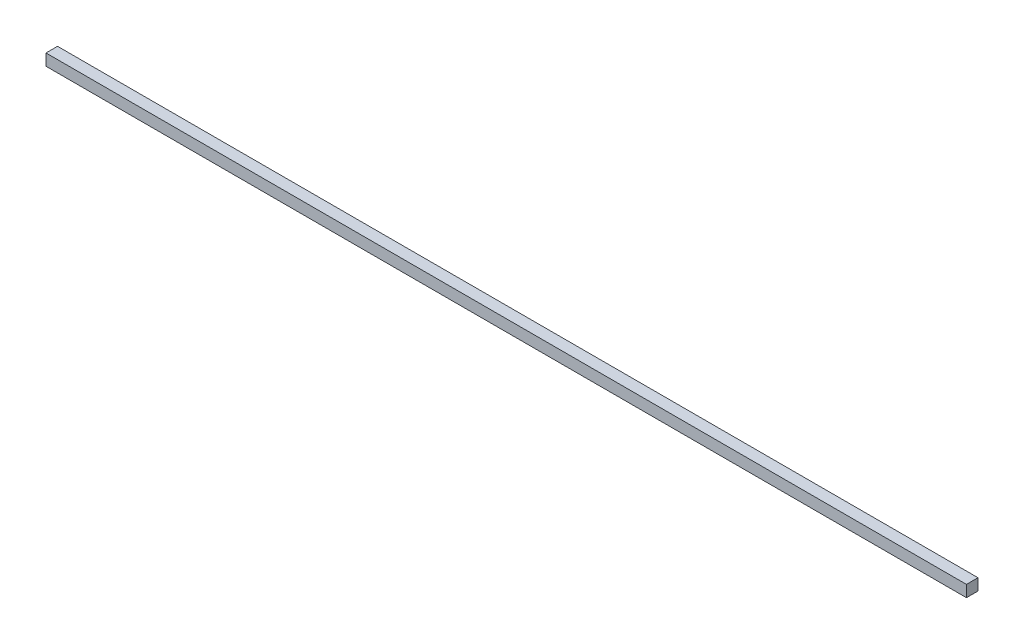
ISO-10303-21;
HEADER;
FILE_DESCRIPTION(('STEP AP214'),'2;1');
FILE_NAME('part.step','',(''),(''),'','','');
FILE_SCHEMA(('AUTOMOTIVE_DESIGN { 1 0 10303 214 1 1 1 1 }'));
ENDSEC;
DATA;
#1=APPLICATION_CONTEXT('core data for automotive mechanical design processes');
#2=APPLICATION_PROTOCOL_DEFINITION('international standard','automotive_design',2000,#1);
#3=PRODUCT_CONTEXT('',#1,'mechanical');
#4=PRODUCT('Part','Part','',(#3));
#5=PRODUCT_RELATED_PRODUCT_CATEGORY('part','',(#4));
#6=PRODUCT_DEFINITION_FORMATION('','',#4);
#7=PRODUCT_DEFINITION_CONTEXT('part definition',#1,'design');
#8=PRODUCT_DEFINITION('design','',#6,#7);
#9=PRODUCT_DEFINITION_SHAPE('','',#8);
#10=(LENGTH_UNIT() NAMED_UNIT(*) SI_UNIT(.MILLI.,.METRE.));
#11=(NAMED_UNIT(*) PLANE_ANGLE_UNIT() SI_UNIT($,.RADIAN.));
#12=(NAMED_UNIT(*) SI_UNIT($,.STERADIAN.) SOLID_ANGLE_UNIT());
#13=UNCERTAINTY_MEASURE_WITH_UNIT(LENGTH_MEASURE(1.E-05),#10,'distance_accuracy_value','');
#14=(GEOMETRIC_REPRESENTATION_CONTEXT(3) GLOBAL_UNCERTAINTY_ASSIGNED_CONTEXT((#13)) GLOBAL_UNIT_ASSIGNED_CONTEXT((#10,
#11,#12)) REPRESENTATION_CONTEXT('',''));
#15=CARTESIAN_POINT('',(0.,0.,0.));
#16=DIRECTION('',(0.,0.,1.));
#17=DIRECTION('',(1.,0.,0.));
#18=AXIS2_PLACEMENT_3D('',#15,#16,#17);
#19=CARTESIAN_POINT('',(59.,408.,-8.));
#20=DIRECTION('',(-1.,0.,0.));
#21=DIRECTION('',(0.,0.,1.));
#22=AXIS2_PLACEMENT_3D('',#19,#20,#21);
#23=PLANE('',#22);
#24=DIRECTION('',(0.,-1.,0.));
#25=VECTOR('',#24,1.);
#26=CARTESIAN_POINT('',(59.,408.,0.));
#27=LINE('',#26,#25);
#28=CARTESIAN_POINT('',(59.,416.,0.));
#29=VERTEX_POINT('',#28);
#30=CARTESIAN_POINT('',(59.,408.,0.));
#31=VERTEX_POINT('',#30);
#32=EDGE_CURVE('E103',#29,#31,#27,.T.);
#33=ORIENTED_EDGE('',*,*,#32,.F.);
#34=DIRECTION('',(0.,0.,1.));
#35=VECTOR('',#34,1.);
#36=CARTESIAN_POINT('',(59.,416.,-8.));
#37=LINE('',#36,#35);
#38=CARTESIAN_POINT('',(59.,416.,-8.));
#39=VERTEX_POINT('',#38);
#40=EDGE_CURVE('E11',#39,#29,#37,.T.);
#41=ORIENTED_EDGE('',*,*,#40,.F.);
#42=DIRECTION('',(0.,-1.,0.));
#43=VECTOR('',#42,1.);
#44=CARTESIAN_POINT('',(59.,408.,-8.));
#45=LINE('',#44,#43);
#46=CARTESIAN_POINT('',(59.,408.,-8.));
#47=VERTEX_POINT('',#46);
#48=EDGE_CURVE('E97',#39,#47,#45,.T.);
#49=ORIENTED_EDGE('',*,*,#48,.T.);
#50=DIRECTION('',(0.,0.,1.));
#51=VECTOR('',#50,1.);
#52=CARTESIAN_POINT('',(59.,408.,-8.));
#53=LINE('',#52,#51);
#54=EDGE_CURVE('E42',#47,#31,#53,.T.);
#55=ORIENTED_EDGE('',*,*,#54,.T.);
#56=EDGE_LOOP('',(#33,#41,#49,#55));
#57=FACE_BOUND('',#56,.T.);
#58=ADVANCED_FACE('F39',(#57),#23,.T.);
#59=CARTESIAN_POINT('',(59.,416.,-8.));
#60=DIRECTION('',(0.,1.,0.));
#61=DIRECTION('',(0.,0.,1.));
#62=AXIS2_PLACEMENT_3D('',#59,#60,#61);
#63=PLANE('',#62);
#64=DIRECTION('',(-1.,0.,0.));
#65=VECTOR('',#64,1.);
#66=CARTESIAN_POINT('',(59.,416.,0.));
#67=LINE('',#66,#65);
#68=CARTESIAN_POINT('',(697.,416.,0.));
#69=VERTEX_POINT('',#68);
#70=EDGE_CURVE('E99',#69,#29,#67,.T.);
#71=ORIENTED_EDGE('',*,*,#70,.F.);
#72=DIRECTION('',(0.,0.,1.));
#73=VECTOR('',#72,1.);
#74=CARTESIAN_POINT('',(697.,416.,-8.));
#75=LINE('',#74,#73);
#76=CARTESIAN_POINT('',(697.,416.,-8.));
#77=VERTEX_POINT('',#76);
#78=EDGE_CURVE('E48',#77,#69,#75,.T.);
#79=ORIENTED_EDGE('',*,*,#78,.F.);
#80=DIRECTION('',(-1.,0.,0.));
#81=VECTOR('',#80,1.);
#82=CARTESIAN_POINT('',(59.,416.,-8.));
#83=LINE('',#82,#81);
#84=EDGE_CURVE('E94',#77,#39,#83,.T.);
#85=ORIENTED_EDGE('',*,*,#84,.T.);
#86=ORIENTED_EDGE('',*,*,#40,.T.);
#87=EDGE_LOOP('',(#71,#79,#85,#86));
#88=FACE_BOUND('',#87,.T.);
#89=ADVANCED_FACE('F113',(#88),#63,.T.);
#90=CARTESIAN_POINT('',(697.,408.,-8.));
#91=DIRECTION('',(1.,0.,0.));
#92=DIRECTION('',(0.,0.,-1.));
#93=AXIS2_PLACEMENT_3D('',#90,#91,#92);
#94=PLANE('',#93);
#95=DIRECTION('',(0.,1.,0.));
#96=VECTOR('',#95,1.);
#97=CARTESIAN_POINT('',(697.,408.,0.));
#98=LINE('',#97,#96);
#99=CARTESIAN_POINT('',(697.,408.,0.));
#100=VERTEX_POINT('',#99);
#101=EDGE_CURVE('E89',#100,#69,#98,.T.);
#102=ORIENTED_EDGE('',*,*,#101,.F.);
#103=DIRECTION('',(0.,0.,1.));
#104=VECTOR('',#103,1.);
#105=CARTESIAN_POINT('',(697.,408.,-8.));
#106=LINE('',#105,#104);
#107=CARTESIAN_POINT('',(697.,408.,-8.));
#108=VERTEX_POINT('',#107);
#109=EDGE_CURVE('E84',#108,#100,#106,.T.);
#110=ORIENTED_EDGE('',*,*,#109,.F.);
#111=DIRECTION('',(0.,1.,0.));
#112=VECTOR('',#111,1.);
#113=CARTESIAN_POINT('',(697.,408.,-8.));
#114=LINE('',#113,#112);
#115=EDGE_CURVE('E87',#108,#77,#114,.T.);
#116=ORIENTED_EDGE('',*,*,#115,.T.);
#117=ORIENTED_EDGE('',*,*,#78,.T.);
#118=EDGE_LOOP('',(#102,#110,#116,#117));
#119=FACE_BOUND('',#118,.T.);
#120=ADVANCED_FACE('F86',(#119),#94,.T.);
#121=CARTESIAN_POINT('',(59.,408.,-8.));
#122=DIRECTION('',(0.,-1.,0.));
#123=DIRECTION('',(0.,0.,-1.));
#124=AXIS2_PLACEMENT_3D('',#121,#122,#123);
#125=PLANE('',#124);
#126=DIRECTION('',(1.,0.,0.));
#127=VECTOR('',#126,1.);
#128=CARTESIAN_POINT('',(59.,408.,0.));
#129=LINE('',#128,#127);
#130=EDGE_CURVE('E106',#31,#100,#129,.T.);
#131=ORIENTED_EDGE('',*,*,#130,.F.);
#132=ORIENTED_EDGE('',*,*,#54,.F.);
#133=DIRECTION('',(1.,0.,0.));
#134=VECTOR('',#133,1.);
#135=CARTESIAN_POINT('',(59.,408.,-8.));
#136=LINE('',#135,#134);
#137=EDGE_CURVE('E93',#47,#108,#136,.T.);
#138=ORIENTED_EDGE('',*,*,#137,.T.);
#139=ORIENTED_EDGE('',*,*,#109,.T.);
#140=EDGE_LOOP('',(#131,#132,#138,#139));
#141=FACE_BOUND('',#140,.T.);
#142=ADVANCED_FACE('F96',(#141),#125,.T.);
#143=CARTESIAN_POINT('',(0.,0.,-8.));
#144=DIRECTION('',(0.,0.,-1.));
#145=DIRECTION('',(-1.,0.,0.));
#146=AXIS2_PLACEMENT_3D('',#143,#144,#145);
#147=PLANE('',#146);
#148=ORIENTED_EDGE('',*,*,#48,.F.);
#149=ORIENTED_EDGE('',*,*,#84,.F.);
#150=ORIENTED_EDGE('',*,*,#115,.F.);
#151=ORIENTED_EDGE('',*,*,#137,.F.);
#152=EDGE_LOOP('',(#148,#149,#150,#151));
#153=FACE_BOUND('',#152,.T.);
#154=ADVANCED_FACE('F92',(#153),#147,.T.);
#155=CARTESIAN_POINT('',(0.,0.,0.));
#156=DIRECTION('',(0.,0.,-1.));
#157=DIRECTION('',(-1.,0.,0.));
#158=AXIS2_PLACEMENT_3D('',#155,#156,#157);
#159=PLANE('',#158);
#160=ORIENTED_EDGE('',*,*,#32,.T.);
#161=ORIENTED_EDGE('',*,*,#130,.T.);
#162=ORIENTED_EDGE('',*,*,#101,.T.);
#163=ORIENTED_EDGE('',*,*,#70,.T.);
#164=EDGE_LOOP('',(#160,#161,#162,#163));
#165=FACE_BOUND('',#164,.T.);
#166=ADVANCED_FACE('F112',(#165),#159,.F.);
#167=CLOSED_SHELL('',(#58,#89,#120,#142,#154,#166));
#168=MANIFOLD_SOLID_BREP('B2',#167);
#169=ADVANCED_BREP_SHAPE_REPRESENTATION('',(#18,#168),#14);
#170=SHAPE_DEFINITION_REPRESENTATION(#9,#169);
ENDSEC;
END-ISO-10303-21;
